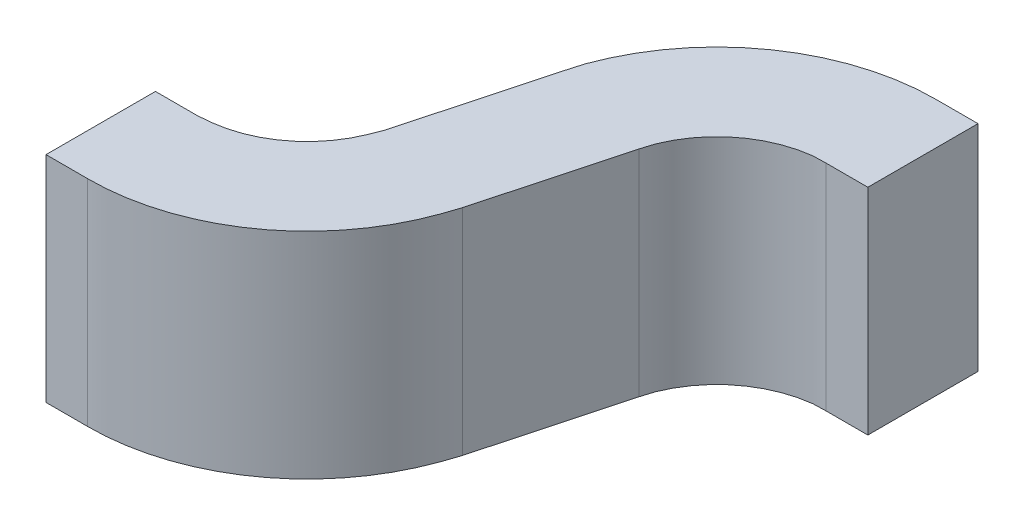
ISO-10303-21;
HEADER;
FILE_DESCRIPTION(('STEP AP214'),'2;1');
FILE_NAME('part.step','',(''),(''),'','','');
FILE_SCHEMA(('AUTOMOTIVE_DESIGN { 1 0 10303 214 1 1 1 1 }'));
ENDSEC;
DATA;
#1=APPLICATION_CONTEXT('core data for automotive mechanical design processes');
#2=APPLICATION_PROTOCOL_DEFINITION('international standard','automotive_design',2000,#1);
#3=PRODUCT_CONTEXT('',#1,'mechanical');
#4=PRODUCT('Part','Part','',(#3));
#5=PRODUCT_RELATED_PRODUCT_CATEGORY('part','',(#4));
#6=PRODUCT_DEFINITION_FORMATION('','',#4);
#7=PRODUCT_DEFINITION_CONTEXT('part definition',#1,'design');
#8=PRODUCT_DEFINITION('design','',#6,#7);
#9=PRODUCT_DEFINITION_SHAPE('','',#8);
#10=(LENGTH_UNIT() NAMED_UNIT(*) SI_UNIT(.MILLI.,.METRE.));
#11=(NAMED_UNIT(*) PLANE_ANGLE_UNIT() SI_UNIT($,.RADIAN.));
#12=(NAMED_UNIT(*) SI_UNIT($,.STERADIAN.) SOLID_ANGLE_UNIT());
#13=UNCERTAINTY_MEASURE_WITH_UNIT(LENGTH_MEASURE(1.E-05),#10,'distance_accuracy_value','');
#14=(GEOMETRIC_REPRESENTATION_CONTEXT(3) GLOBAL_UNCERTAINTY_ASSIGNED_CONTEXT((#13)) GLOBAL_UNIT_ASSIGNED_CONTEXT((#10,
#11,#12)) REPRESENTATION_CONTEXT('',''));
#15=CARTESIAN_POINT('',(0.,0.,0.));
#16=DIRECTION('',(0.,0.,1.));
#17=DIRECTION('',(1.,0.,0.));
#18=AXIS2_PLACEMENT_3D('',#15,#16,#17);
#19=CARTESIAN_POINT('',(1.054,0.152,0.543));
#20=DIRECTION('',(-1.,0.,0.));
#21=DIRECTION('',(0.,0.,1.));
#22=AXIS2_PLACEMENT_3D('',#19,#20,#21);
#23=PLANE('',#22);
#24=DIRECTION('',(0.,1.,0.));
#25=VECTOR('',#24,1.);
#26=CARTESIAN_POINT('',(1.054,-0.152,0.543));
#27=LINE('',#26,#25);
#28=CARTESIAN_POINT('',(1.054,-0.152,0.543));
#29=VERTEX_POINT('',#28);
#30=CARTESIAN_POINT('',(1.054,0.152,0.543));
#31=VERTEX_POINT('',#30);
#32=EDGE_CURVE('E11',#29,#31,#27,.T.);
#33=ORIENTED_EDGE('',*,*,#32,.F.);
#34=DIRECTION('',(0.,0.,-1.));
#35=VECTOR('',#34,1.);
#36=CARTESIAN_POINT('',(1.054,-0.152,0.698));
#37=LINE('',#36,#35);
#38=CARTESIAN_POINT('',(1.054,-0.152,0.698));
#39=VERTEX_POINT('',#38);
#40=EDGE_CURVE('E24',#39,#29,#37,.T.);
#41=ORIENTED_EDGE('',*,*,#40,.F.);
#42=DIRECTION('',(0.,-1.,0.));
#43=VECTOR('',#42,1.);
#44=CARTESIAN_POINT('',(1.054,0.152,0.698));
#45=LINE('',#44,#43);
#46=CARTESIAN_POINT('',(1.054,0.152,0.698));
#47=VERTEX_POINT('',#46);
#48=EDGE_CURVE('E439',#47,#39,#45,.T.);
#49=ORIENTED_EDGE('',*,*,#48,.F.);
#50=DIRECTION('',(0.,0.,1.));
#51=VECTOR('',#50,1.);
#52=CARTESIAN_POINT('',(1.054,0.152,0.543));
#53=LINE('',#52,#51);
#54=EDGE_CURVE('E437',#31,#47,#53,.T.);
#55=ORIENTED_EDGE('',*,*,#54,.F.);
#56=EDGE_LOOP('',(#33,#41,#49,#55));
#57=FACE_BOUND('',#56,.T.);
#58=ADVANCED_FACE('F17',(#57),#23,.T.);
#59=CARTESIAN_POINT('',(1.054,0.152,0.698));
#60=DIRECTION('',(0.,0.,1.));
#61=DIRECTION('',(0.,1.,0.));
#62=AXIS2_PLACEMENT_3D('',#59,#60,#61);
#63=PLANE('',#62);
#64=ORIENTED_EDGE('',*,*,#48,.T.);
#65=DIRECTION('',(-1.,0.,0.));
#66=VECTOR('',#65,1.);
#67=CARTESIAN_POINT('',(1.113,-0.152,0.698));
#68=LINE('',#67,#66);
#69=CARTESIAN_POINT('',(1.113,-0.152,0.698));
#70=VERTEX_POINT('',#69);
#71=EDGE_CURVE('E435',#70,#39,#68,.T.);
#72=ORIENTED_EDGE('',*,*,#71,.F.);
#73=CARTESIAN_POINT('',(1.113,0.152,0.69815));
#74=DIRECTION('',(0.,-1.,0.));
#75=VECTOR('',#74,1.);
#76=LINE('',#73,#75);
#77=CARTESIAN_POINT('',(1.113,0.152,0.698));
#78=VERTEX_POINT('',#77);
#79=EDGE_CURVE('E257',#78,#70,#76,.T.);
#80=ORIENTED_EDGE('',*,*,#79,.F.);
#81=DIRECTION('',(1.,0.,0.));
#82=VECTOR('',#81,1.);
#83=CARTESIAN_POINT('',(1.054,0.152,0.698));
#84=LINE('',#83,#82);
#85=EDGE_CURVE('E247',#47,#78,#84,.T.);
#86=ORIENTED_EDGE('',*,*,#85,.F.);
#87=EDGE_LOOP('',(#64,#72,#80,#86));
#88=FACE_BOUND('',#87,.T.);
#89=ADVANCED_FACE('F237',(#88),#63,.T.);
#90=CARTESIAN_POINT('',(1.054,-0.152,0.543));
#91=DIRECTION('',(0.,0.,-1.));
#92=DIRECTION('',(0.,1.,0.));
#93=AXIS2_PLACEMENT_3D('',#90,#91,#92);
#94=PLANE('',#93);
#95=ORIENTED_EDGE('',*,*,#32,.T.);
#96=DIRECTION('',(-1.,0.,0.));
#97=VECTOR('',#96,1.);
#98=CARTESIAN_POINT('',(1.113,0.152,0.543));
#99=LINE('',#98,#97);
#100=CARTESIAN_POINT('',(1.113,0.152,0.543));
#101=VERTEX_POINT('',#100);
#102=EDGE_CURVE('E443',#101,#31,#99,.T.);
#103=ORIENTED_EDGE('',*,*,#102,.F.);
#104=CARTESIAN_POINT('',(1.113,-0.152,0.542575));
#105=DIRECTION('',(0.,1.,0.));
#106=VECTOR('',#105,1.);
#107=LINE('',#104,#106);
#108=CARTESIAN_POINT('',(1.113,-0.152,0.543));
#109=VERTEX_POINT('',#108);
#110=EDGE_CURVE('E222',#109,#101,#107,.T.);
#111=ORIENTED_EDGE('',*,*,#110,.F.);
#112=DIRECTION('',(1.,0.,0.));
#113=VECTOR('',#112,1.);
#114=CARTESIAN_POINT('',(1.054,-0.152,0.543));
#115=LINE('',#114,#113);
#116=EDGE_CURVE('E219',#29,#109,#115,.T.);
#117=ORIENTED_EDGE('',*,*,#116,.F.);
#118=EDGE_LOOP('',(#95,#103,#111,#117));
#119=FACE_BOUND('',#118,.T.);
#120=ADVANCED_FACE('F228',(#119),#94,.T.);
#121=CARTESIAN_POINT('',(1.467,-0.152,0.271));
#122=DIRECTION('',(0.965885549343203,0.,0.258969313954337));
#123=DIRECTION('',(-0.258969313954337,0.,0.965885549343203));
#124=AXIS2_PLACEMENT_3D('',#121,#122,#123);
#125=PLANE('',#124);
#126=CARTESIAN_POINT('',(1.46667799927154,0.152,0.270914133139076));
#127=DIRECTION('',(0.,-1.,0.));
#128=VECTOR('',#127,1.);
#129=LINE('',#126,#128);
#130=CARTESIAN_POINT('',(1.467,0.152,0.271));
#131=VERTEX_POINT('',#130);
#132=CARTESIAN_POINT('',(1.467,-0.152,0.271));
#133=VERTEX_POINT('',#132);
#134=EDGE_CURVE('E215',#131,#133,#129,.T.);
#135=ORIENTED_EDGE('',*,*,#134,.F.);
#136=CARTESIAN_POINT('',(1.414,0.152,0.468));
#137=DIRECTION('',(0.258969313954337,0.,-0.965885549343202));
#138=VECTOR('',#137,1.);
#139=LINE('',#136,#138);
#140=CARTESIAN_POINT('',(1.414,0.152,0.468));
#141=VERTEX_POINT('',#140);
#142=EDGE_CURVE('E301',#141,#131,#139,.T.);
#143=ORIENTED_EDGE('',*,*,#142,.F.);
#144=CARTESIAN_POINT('',(1.41346097901335,-0.152,0.467854947840802));
#145=DIRECTION('',(0.,1.,0.));
#146=VECTOR('',#145,1.);
#147=LINE('',#144,#146);
#148=CARTESIAN_POINT('',(1.414,-0.152,0.468));
#149=VERTEX_POINT('',#148);
#150=EDGE_CURVE('E288',#149,#141,#147,.T.);
#151=ORIENTED_EDGE('',*,*,#150,.F.);
#152=DIRECTION('',(-0.258969313954337,0.,0.965885549343203));
#153=VECTOR('',#152,1.);
#154=CARTESIAN_POINT('',(1.467,-0.152,0.271));
#155=LINE('',#154,#153);
#156=EDGE_CURVE('E356',#133,#149,#155,.T.);
#157=ORIENTED_EDGE('',*,*,#156,.F.);
#158=EDGE_LOOP('',(#135,#143,#151,#157));
#159=FACE_BOUND('',#158,.T.);
#160=ADVANCED_FACE('F236',(#159),#125,.T.);
#161=CARTESIAN_POINT('',(1.317,0.152,0.231));
#162=DIRECTION('',(-0.965885549343203,0.,-0.258969313954337));
#163=DIRECTION('',(-0.258969313954337,0.,0.965885549343203));
#164=AXIS2_PLACEMENT_3D('',#161,#162,#163);
#165=PLANE('',#164);
#166=CARTESIAN_POINT('',(1.31635599854307,-0.152,0.230828266278153));
#167=DIRECTION('',(0.,1.,0.));
#168=VECTOR('',#167,1.);
#169=LINE('',#166,#168);
#170=CARTESIAN_POINT('',(1.317,-0.152,0.231));
#171=VERTEX_POINT('',#170);
#172=CARTESIAN_POINT('',(1.317,0.152,0.231));
#173=VERTEX_POINT('',#172);
#174=EDGE_CURVE('E342',#171,#173,#169,.T.);
#175=ORIENTED_EDGE('',*,*,#174,.F.);
#176=CARTESIAN_POINT('',(1.264,-0.152,0.428));
#177=DIRECTION('',(0.258969313954337,0.,-0.965885549343202));
#178=VECTOR('',#177,1.);
#179=LINE('',#176,#178);
#180=CARTESIAN_POINT('',(1.264,-0.152,0.428));
#181=VERTEX_POINT('',#180);
#182=EDGE_CURVE('E330',#181,#171,#179,.T.);
#183=ORIENTED_EDGE('',*,*,#182,.F.);
#184=CARTESIAN_POINT('',(1.2631389278252,0.152,0.427766198945916));
#185=DIRECTION('',(0.,-1.,0.));
#186=VECTOR('',#185,1.);
#187=LINE('',#184,#186);
#188=CARTESIAN_POINT('',(1.264,0.152,0.428));
#189=VERTEX_POINT('',#188);
#190=EDGE_CURVE('E366',#189,#181,#187,.T.);
#191=ORIENTED_EDGE('',*,*,#190,.F.);
#192=DIRECTION('',(-0.258969313954337,0.,0.965885549343203));
#193=VECTOR('',#192,1.);
#194=CARTESIAN_POINT('',(1.317,0.152,0.231));
#195=LINE('',#194,#193);
#196=EDGE_CURVE('E368',#173,#189,#195,.T.);
#197=ORIENTED_EDGE('',*,*,#196,.F.);
#198=EDGE_LOOP('',(#175,#183,#191,#197));
#199=FACE_BOUND('',#198,.T.);
#200=ADVANCED_FACE('F160',(#199),#165,.T.);
#201=CARTESIAN_POINT('',(1.676,-0.152,0.156));
#202=DIRECTION('',(0.,0.,1.));
#203=DIRECTION('',(0.,1.,0.));
#204=AXIS2_PLACEMENT_3D('',#201,#202,#203);
#205=PLANE('',#204);
#206=DIRECTION('',(0.,-1.,0.));
#207=VECTOR('',#206,1.);
#208=CARTESIAN_POINT('',(1.676,0.152,0.156));
#209=LINE('',#208,#207);
#210=CARTESIAN_POINT('',(1.676,0.152,0.156));
#211=VERTEX_POINT('',#210);
#212=CARTESIAN_POINT('',(1.676,-0.152,0.156));
#213=VERTEX_POINT('',#212);
#214=EDGE_CURVE('E125',#211,#213,#209,.T.);
#215=ORIENTED_EDGE('',*,*,#214,.F.);
#216=DIRECTION('',(1.,0.,0.));
#217=VECTOR('',#216,1.);
#218=CARTESIAN_POINT('',(1.617,0.152,0.156));
#219=LINE('',#218,#217);
#220=CARTESIAN_POINT('',(1.617,0.152,0.156));
#221=VERTEX_POINT('',#220);
#222=EDGE_CURVE('E377',#221,#211,#219,.T.);
#223=ORIENTED_EDGE('',*,*,#222,.F.);
#224=CARTESIAN_POINT('',(1.617,-0.152,0.155425));
#225=DIRECTION('',(0.,1.,0.));
#226=VECTOR('',#225,1.);
#227=LINE('',#224,#226);
#228=CARTESIAN_POINT('',(1.617,-0.152,0.156));
#229=VERTEX_POINT('',#228);
#230=EDGE_CURVE('E178',#229,#221,#227,.T.);
#231=ORIENTED_EDGE('',*,*,#230,.F.);
#232=DIRECTION('',(-1.,0.,0.));
#233=VECTOR('',#232,1.);
#234=CARTESIAN_POINT('',(1.676,-0.152,0.156));
#235=LINE('',#234,#233);
#236=EDGE_CURVE('E169',#213,#229,#235,.T.);
#237=ORIENTED_EDGE('',*,*,#236,.F.);
#238=EDGE_LOOP('',(#215,#223,#231,#237));
#239=FACE_BOUND('',#238,.T.);
#240=ADVANCED_FACE('F155',(#239),#205,.T.);
#241=CARTESIAN_POINT('',(1.617,-0.152,0.));
#242=DIRECTION('',(0.,0.,-1.));
#243=DIRECTION('',(0.,1.,0.));
#244=AXIS2_PLACEMENT_3D('',#241,#242,#243);
#245=PLANE('',#244);
#246=CARTESIAN_POINT('',(1.617,0.152,-0.000149999999999977));
#247=DIRECTION('',(0.,-1.,0.));
#248=VECTOR('',#247,1.);
#249=LINE('',#246,#248);
#250=CARTESIAN_POINT('',(1.617,0.152,0.));
#251=VERTEX_POINT('',#250);
#252=CARTESIAN_POINT('',(1.617,-0.152,0.));
#253=VERTEX_POINT('',#252);
#254=EDGE_CURVE('E140',#251,#253,#249,.T.);
#255=ORIENTED_EDGE('',*,*,#254,.F.);
#256=DIRECTION('',(-1.,0.,0.));
#257=VECTOR('',#256,1.);
#258=CARTESIAN_POINT('',(1.676,0.152,0.));
#259=LINE('',#258,#257);
#260=CARTESIAN_POINT('',(1.676,0.152,0.));
#261=VERTEX_POINT('',#260);
#262=EDGE_CURVE('E107',#261,#251,#259,.T.);
#263=ORIENTED_EDGE('',*,*,#262,.F.);
#264=DIRECTION('',(0.,1.,0.));
#265=VECTOR('',#264,1.);
#266=CARTESIAN_POINT('',(1.676,-0.152,0.));
#267=LINE('',#266,#265);
#268=CARTESIAN_POINT('',(1.676,-0.152,0.));
#269=VERTEX_POINT('',#268);
#270=EDGE_CURVE('E101',#269,#261,#267,.T.);
#271=ORIENTED_EDGE('',*,*,#270,.F.);
#272=DIRECTION('',(1.,0.,0.));
#273=VECTOR('',#272,1.);
#274=CARTESIAN_POINT('',(1.617,-0.152,0.));
#275=LINE('',#274,#273);
#276=EDGE_CURVE('E104',#253,#269,#275,.T.);
#277=ORIENTED_EDGE('',*,*,#276,.F.);
#278=EDGE_LOOP('',(#255,#263,#271,#277));
#279=FACE_BOUND('',#278,.T.);
#280=ADVANCED_FACE('F103',(#279),#245,.T.);
#281=CARTESIAN_POINT('',(1.676,-0.152,0.));
#282=DIRECTION('',(1.,0.,0.));
#283=DIRECTION('',(0.,0.,1.));
#284=AXIS2_PLACEMENT_3D('',#281,#282,#283);
#285=PLANE('',#284);
#286=ORIENTED_EDGE('',*,*,#270,.T.);
#287=DIRECTION('',(0.,0.,-1.));
#288=VECTOR('',#287,1.);
#289=CARTESIAN_POINT('',(1.676,0.152,0.156));
#290=LINE('',#289,#288);
#291=EDGE_CURVE('E122',#211,#261,#290,.T.);
#292=ORIENTED_EDGE('',*,*,#291,.F.);
#293=ORIENTED_EDGE('',*,*,#214,.T.);
#294=DIRECTION('',(0.,0.,1.));
#295=VECTOR('',#294,1.);
#296=CARTESIAN_POINT('',(1.676,-0.152,0.));
#297=LINE('',#296,#295);
#298=EDGE_CURVE('E118',#269,#213,#297,.T.);
#299=ORIENTED_EDGE('',*,*,#298,.F.);
#300=EDGE_LOOP('',(#286,#292,#293,#299));
#301=FACE_BOUND('',#300,.T.);
#302=ADVANCED_FACE('F124',(#301),#285,.T.);
#303=CARTESIAN_POINT('',(1.113,0.152,0.387));
#304=DIRECTION('',(0.,1.,0.));
#305=DIRECTION('',(0.,0.,1.));
#306=AXIS2_PLACEMENT_3D('',#303,#304,#305);
#307=CYLINDRICAL_SURFACE('',#306,0.31115);
#308=ORIENTED_EDGE('',*,*,#79,.T.);
#309=CARTESIAN_POINT('',(1.113,-0.152,0.387));
#310=DIRECTION('',(0.,-1.,0.));
#311=DIRECTION('',(-0.793107076683516,0.,0.609082231652284));
#312=AXIS2_PLACEMENT_3D('',#309,#310,#311);
#313=CIRCLE('',#312,0.31115);
#314=EDGE_CURVE('E127',#149,#70,#313,.T.);
#315=ORIENTED_EDGE('',*,*,#314,.F.);
#316=ORIENTED_EDGE('',*,*,#150,.T.);
#317=CARTESIAN_POINT('',(1.113,0.152,0.387));
#318=DIRECTION('',(0.,1.,0.));
#319=DIRECTION('',(0.793107076683516,0.,-0.609082231652284));
#320=AXIS2_PLACEMENT_3D('',#317,#318,#319);
#321=CIRCLE('',#320,0.31115);
#322=EDGE_CURVE('E131',#78,#141,#321,.T.);
#323=ORIENTED_EDGE('',*,*,#322,.F.);
#324=EDGE_LOOP('',(#308,#315,#316,#323));
#325=FACE_BOUND('',#324,.T.);
#326=ADVANCED_FACE('F263',(#325),#307,.T.);
#327=CARTESIAN_POINT('',(1.113,-0.152,0.387));
#328=DIRECTION('',(0.,1.,0.));
#329=DIRECTION('',(0.,0.,-1.));
#330=AXIS2_PLACEMENT_3D('',#327,#328,#329);
#331=CYLINDRICAL_SURFACE('',#330,0.155575);
#332=ORIENTED_EDGE('',*,*,#110,.T.);
#333=CARTESIAN_POINT('',(1.113,0.152,0.387));
#334=DIRECTION('',(0.,-1.,0.));
#335=DIRECTION('',(-0.793107076683516,0.,0.609082231652284));
#336=AXIS2_PLACEMENT_3D('',#333,#334,#335);
#337=CIRCLE('',#336,0.155575);
#338=EDGE_CURVE('E427',#189,#101,#337,.T.);
#339=ORIENTED_EDGE('',*,*,#338,.F.);
#340=ORIENTED_EDGE('',*,*,#190,.T.);
#341=CARTESIAN_POINT('',(1.113,-0.152,0.387));
#342=DIRECTION('',(0.,1.,0.));
#343=DIRECTION('',(0.793107076683516,0.,-0.609082231652284));
#344=AXIS2_PLACEMENT_3D('',#341,#342,#343);
#345=CIRCLE('',#344,0.155575);
#346=EDGE_CURVE('E423',#109,#181,#345,.T.);
#347=ORIENTED_EDGE('',*,*,#346,.F.);
#348=EDGE_LOOP('',(#332,#339,#340,#347));
#349=FACE_BOUND('',#348,.T.);
#350=ADVANCED_FACE('F195',(#349),#331,.F.);
#351=CARTESIAN_POINT('',(1.617,-0.152,0.311));
#352=DIRECTION('',(0.,1.,0.));
#353=DIRECTION('',(0.,0.,1.));
#354=AXIS2_PLACEMENT_3D('',#351,#352,#353);
#355=CYLINDRICAL_SURFACE('',#354,0.155575);
#356=ORIENTED_EDGE('',*,*,#230,.T.);
#357=CARTESIAN_POINT('',(1.617,0.152,0.311));
#358=DIRECTION('',(0.,-1.,0.));
#359=DIRECTION('',(0.793107076683516,0.,-0.609082231652284));
#360=AXIS2_PLACEMENT_3D('',#357,#358,#359);
#361=CIRCLE('',#360,0.155575);
#362=EDGE_CURVE('E418',#131,#221,#361,.T.);
#363=ORIENTED_EDGE('',*,*,#362,.F.);
#364=ORIENTED_EDGE('',*,*,#134,.T.);
#365=CARTESIAN_POINT('',(1.617,-0.152,0.311));
#366=DIRECTION('',(0.,1.,0.));
#367=DIRECTION('',(-0.793107076683516,0.,0.609082231652284));
#368=AXIS2_PLACEMENT_3D('',#365,#366,#367);
#369=CIRCLE('',#368,0.155575);
#370=EDGE_CURVE('E408',#229,#133,#369,.T.);
#371=ORIENTED_EDGE('',*,*,#370,.F.);
#372=EDGE_LOOP('',(#356,#363,#364,#371));
#373=FACE_BOUND('',#372,.T.);
#374=ADVANCED_FACE('F184',(#373),#355,.F.);
#375=CARTESIAN_POINT('',(1.617,-0.152,0.311));
#376=DIRECTION('',(0.,1.,0.));
#377=DIRECTION('',(0.,0.,-1.));
#378=AXIS2_PLACEMENT_3D('',#375,#376,#377);
#379=CYLINDRICAL_SURFACE('',#378,0.31115);
#380=ORIENTED_EDGE('',*,*,#254,.T.);
#381=CARTESIAN_POINT('',(1.617,-0.152,0.311));
#382=DIRECTION('',(0.,-1.,0.));
#383=DIRECTION('',(0.793107076683516,0.,-0.609082231652284));
#384=AXIS2_PLACEMENT_3D('',#381,#382,#383);
#385=CIRCLE('',#384,0.31115);
#386=EDGE_CURVE('E121',#171,#253,#385,.T.);
#387=ORIENTED_EDGE('',*,*,#386,.F.);
#388=ORIENTED_EDGE('',*,*,#174,.T.);
#389=CARTESIAN_POINT('',(1.617,0.152,0.311));
#390=DIRECTION('',(0.,1.,0.));
#391=DIRECTION('',(-0.793107076683516,0.,0.609082231652284));
#392=AXIS2_PLACEMENT_3D('',#389,#390,#391);
#393=CIRCLE('',#392,0.31115);
#394=EDGE_CURVE('E405',#251,#173,#393,.T.);
#395=ORIENTED_EDGE('',*,*,#394,.F.);
#396=EDGE_LOOP('',(#380,#387,#388,#395));
#397=FACE_BOUND('',#396,.T.);
#398=ADVANCED_FACE('F194',(#397),#379,.T.);
#399=CARTESIAN_POINT('',(1.054,-0.152,0.543));
#400=DIRECTION('',(0.,-1.,0.));
#401=DIRECTION('',(1.,0.,0.));
#402=AXIS2_PLACEMENT_3D('',#399,#400,#401);
#403=PLANE('',#402);
#404=ORIENTED_EDGE('',*,*,#71,.T.);
#405=ORIENTED_EDGE('',*,*,#40,.T.);
#406=ORIENTED_EDGE('',*,*,#116,.T.);
#407=ORIENTED_EDGE('',*,*,#346,.T.);
#408=ORIENTED_EDGE('',*,*,#182,.T.);
#409=ORIENTED_EDGE('',*,*,#386,.T.);
#410=ORIENTED_EDGE('',*,*,#276,.T.);
#411=ORIENTED_EDGE('',*,*,#298,.T.);
#412=ORIENTED_EDGE('',*,*,#236,.T.);
#413=ORIENTED_EDGE('',*,*,#370,.T.);
#414=ORIENTED_EDGE('',*,*,#156,.T.);
#415=ORIENTED_EDGE('',*,*,#314,.T.);
#416=EDGE_LOOP('',(#404,#405,#406,#407,#408,#409,#410,#411,#412,#413,#414,#415));
#417=FACE_BOUND('',#416,.T.);
#418=ADVANCED_FACE('F116',(#417),#403,.T.);
#419=CARTESIAN_POINT('',(1.617,0.152,0.156));
#420=DIRECTION('',(0.,1.,0.));
#421=DIRECTION('',(1.,0.,0.));
#422=AXIS2_PLACEMENT_3D('',#419,#420,#421);
#423=PLANE('',#422);
#424=ORIENTED_EDGE('',*,*,#102,.T.);
#425=ORIENTED_EDGE('',*,*,#54,.T.);
#426=ORIENTED_EDGE('',*,*,#85,.T.);
#427=ORIENTED_EDGE('',*,*,#322,.T.);
#428=ORIENTED_EDGE('',*,*,#142,.T.);
#429=ORIENTED_EDGE('',*,*,#362,.T.);
#430=ORIENTED_EDGE('',*,*,#222,.T.);
#431=ORIENTED_EDGE('',*,*,#291,.T.);
#432=ORIENTED_EDGE('',*,*,#262,.T.);
#433=ORIENTED_EDGE('',*,*,#394,.T.);
#434=ORIENTED_EDGE('',*,*,#196,.T.);
#435=ORIENTED_EDGE('',*,*,#338,.T.);
#436=EDGE_LOOP('',(#424,#425,#426,#427,#428,#429,#430,#431,#432,#433,#434,#435));
#437=FACE_BOUND('',#436,.T.);
#438=ADVANCED_FACE('F306',(#437),#423,.T.);
#439=CLOSED_SHELL('',(#58,#89,#120,#160,#200,#240,#280,#302,#326,#350,#374,#398,#418,#438));
#440=MANIFOLD_SOLID_BREP('B1',#439);
#441=ADVANCED_BREP_SHAPE_REPRESENTATION('',(#18,#440),#14);
#442=SHAPE_DEFINITION_REPRESENTATION(#9,#441);
ENDSEC;
END-ISO-10303-21;
